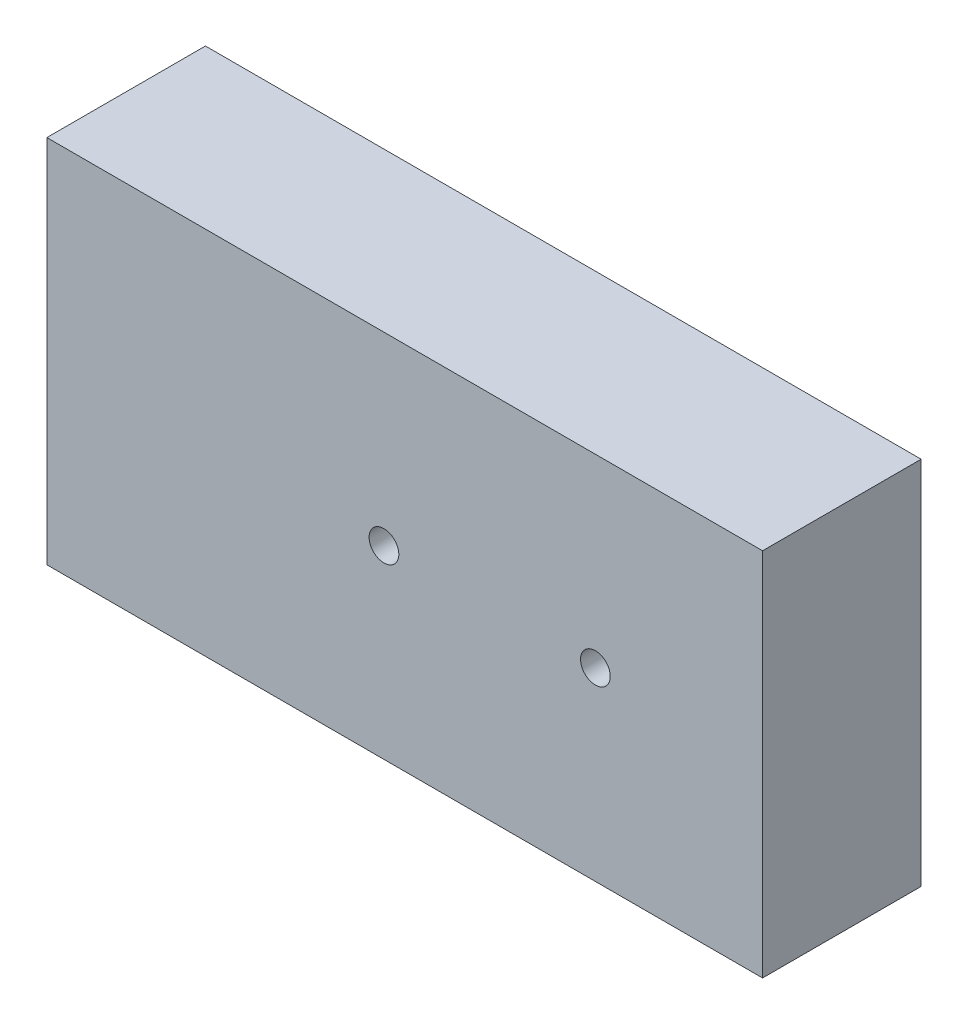
ISO-10303-21;
HEADER;
FILE_DESCRIPTION(('STEP AP214'),'2;1');
FILE_NAME('part.step','',(''),(''),'','','');
FILE_SCHEMA(('AUTOMOTIVE_DESIGN { 1 0 10303 214 1 1 1 1 }'));
ENDSEC;
DATA;
#1=APPLICATION_CONTEXT('core data for automotive mechanical design processes');
#2=APPLICATION_PROTOCOL_DEFINITION('international standard','automotive_design',2000,#1);
#3=PRODUCT_CONTEXT('',#1,'mechanical');
#4=PRODUCT('Part','Part','',(#3));
#5=PRODUCT_RELATED_PRODUCT_CATEGORY('part','',(#4));
#6=PRODUCT_DEFINITION_FORMATION('','',#4);
#7=PRODUCT_DEFINITION_CONTEXT('part definition',#1,'design');
#8=PRODUCT_DEFINITION('design','',#6,#7);
#9=PRODUCT_DEFINITION_SHAPE('','',#8);
#10=(LENGTH_UNIT() NAMED_UNIT(*) SI_UNIT(.MILLI.,.METRE.));
#11=(NAMED_UNIT(*) PLANE_ANGLE_UNIT() SI_UNIT($,.RADIAN.));
#12=(NAMED_UNIT(*) SI_UNIT($,.STERADIAN.) SOLID_ANGLE_UNIT());
#13=UNCERTAINTY_MEASURE_WITH_UNIT(LENGTH_MEASURE(1.E-05),#10,'distance_accuracy_value','');
#14=(GEOMETRIC_REPRESENTATION_CONTEXT(3) GLOBAL_UNCERTAINTY_ASSIGNED_CONTEXT((#13)) GLOBAL_UNIT_ASSIGNED_CONTEXT((#10,
#11,#12)) REPRESENTATION_CONTEXT('',''));
#15=CARTESIAN_POINT('',(0.,0.,0.));
#16=DIRECTION('',(0.,0.,1.));
#17=DIRECTION('',(1.,0.,0.));
#18=AXIS2_PLACEMENT_3D('',#15,#16,#17);
#19=CARTESIAN_POINT('',(171.958,0.,0.));
#20=DIRECTION('',(0.,0.,-1.));
#21=DIRECTION('',(-1.,0.,0.));
#22=AXIS2_PLACEMENT_3D('',#19,#20,#21);
#23=PLANE('',#22);
#24=CARTESIAN_POINT('',(131.79298,44.4500000000001,0.));
#25=DIRECTION('',(0.,0.,-1.));
#26=DIRECTION('',(-1.,0.,0.));
#27=AXIS2_PLACEMENT_3D('',#24,#25,#26);
#28=CIRCLE('',#27,3.57187500000001);
#29=CARTESIAN_POINT('',(128.221105,44.4500000000001,0.));
#30=VERTEX_POINT('',#29);
#31=EDGE_CURVE('E98',#30,#30,#28,.T.);
#32=ORIENTED_EDGE('',*,*,#31,.T.);
#33=EDGE_LOOP('',(#32));
#34=FACE_BOUND('',#33,.T.);
#35=CARTESIAN_POINT('',(80.99298,44.4500000000001,0.));
#36=DIRECTION('',(0.,0.,-1.));
#37=DIRECTION('',(-1.,0.,0.));
#38=AXIS2_PLACEMENT_3D('',#35,#36,#37);
#39=CIRCLE('',#38,3.57187500000001);
#40=CARTESIAN_POINT('',(77.421105,44.4500000000001,0.));
#41=VERTEX_POINT('',#40);
#42=EDGE_CURVE('E112',#41,#41,#39,.T.);
#43=ORIENTED_EDGE('',*,*,#42,.T.);
#44=EDGE_LOOP('',(#43));
#45=FACE_BOUND('',#44,.T.);
#46=DIRECTION('',(0.,-1.,0.));
#47=VECTOR('',#46,1.);
#48=CARTESIAN_POINT('',(0.,0.,0.));
#49=LINE('',#48,#47);
#50=CARTESIAN_POINT('',(0.,88.9,0.));
#51=VERTEX_POINT('',#50);
#52=CARTESIAN_POINT('',(0.,0.,0.));
#53=VERTEX_POINT('',#52);
#54=EDGE_CURVE('E95',#51,#53,#49,.T.);
#55=ORIENTED_EDGE('',*,*,#54,.T.);
#56=DIRECTION('',(-1.,0.,0.));
#57=VECTOR('',#56,1.);
#58=CARTESIAN_POINT('',(171.958,0.,0.));
#59=LINE('',#58,#57);
#60=CARTESIAN_POINT('',(171.958,0.,0.));
#61=VERTEX_POINT('',#60);
#62=EDGE_CURVE('E11',#61,#53,#59,.T.);
#63=ORIENTED_EDGE('',*,*,#62,.F.);
#64=DIRECTION('',(0.,-1.,0.));
#65=VECTOR('',#64,1.);
#66=CARTESIAN_POINT('',(171.958,0.,0.));
#67=LINE('',#66,#65);
#68=CARTESIAN_POINT('',(171.958,88.9,0.));
#69=VERTEX_POINT('',#68);
#70=EDGE_CURVE('E83',#69,#61,#67,.T.);
#71=ORIENTED_EDGE('',*,*,#70,.F.);
#72=DIRECTION('',(-1.,0.,0.));
#73=VECTOR('',#72,1.);
#74=CARTESIAN_POINT('',(171.958,88.9,0.));
#75=LINE('',#74,#73);
#76=EDGE_CURVE('E91',#69,#51,#75,.T.);
#77=ORIENTED_EDGE('',*,*,#76,.T.);
#78=EDGE_LOOP('',(#55,#63,#71,#77));
#79=FACE_BOUND('',#78,.T.);
#80=ADVANCED_FACE('F32',(#34,#45,#79),#23,.F.);
#81=CARTESIAN_POINT('',(171.958,0.,0.));
#82=DIRECTION('',(0.,1.,0.));
#83=DIRECTION('',(0.,0.,1.));
#84=AXIS2_PLACEMENT_3D('',#81,#82,#83);
#85=PLANE('',#84);
#86=DIRECTION('',(0.,0.,-1.));
#87=VECTOR('',#86,1.);
#88=CARTESIAN_POINT('',(0.,0.,0.));
#89=LINE('',#88,#87);
#90=CARTESIAN_POINT('',(0.,0.,-38.1));
#91=VERTEX_POINT('',#90);
#92=EDGE_CURVE('E87',#53,#91,#89,.T.);
#93=ORIENTED_EDGE('',*,*,#92,.T.);
#94=DIRECTION('',(-1.,0.,0.));
#95=VECTOR('',#94,1.);
#96=CARTESIAN_POINT('',(171.958,0.,-38.1));
#97=LINE('',#96,#95);
#98=CARTESIAN_POINT('',(171.958,0.,-38.1));
#99=VERTEX_POINT('',#98);
#100=EDGE_CURVE('E40',#99,#91,#97,.T.);
#101=ORIENTED_EDGE('',*,*,#100,.F.);
#102=DIRECTION('',(0.,0.,-1.));
#103=VECTOR('',#102,1.);
#104=CARTESIAN_POINT('',(171.958,0.,0.));
#105=LINE('',#104,#103);
#106=EDGE_CURVE('E78',#61,#99,#105,.T.);
#107=ORIENTED_EDGE('',*,*,#106,.F.);
#108=ORIENTED_EDGE('',*,*,#62,.T.);
#109=EDGE_LOOP('',(#93,#101,#107,#108));
#110=FACE_BOUND('',#109,.T.);
#111=ADVANCED_FACE('F86',(#110),#85,.F.);
#112=CARTESIAN_POINT('',(171.958,0.,-38.1));
#113=DIRECTION('',(0.,0.,1.));
#114=DIRECTION('',(1.,0.,0.));
#115=AXIS2_PLACEMENT_3D('',#112,#113,#114);
#116=PLANE('',#115);
#117=CARTESIAN_POINT('',(131.79298,44.4500000000001,-38.1));
#118=DIRECTION('',(0.,0.,-1.));
#119=DIRECTION('',(-1.,0.,0.));
#120=AXIS2_PLACEMENT_3D('',#117,#118,#119);
#121=CIRCLE('',#120,3.57187500000001);
#122=CARTESIAN_POINT('',(128.221105,44.4500000000001,-38.1));
#123=VERTEX_POINT('',#122);
#124=EDGE_CURVE('E115',#123,#123,#121,.T.);
#125=ORIENTED_EDGE('',*,*,#124,.F.);
#126=EDGE_LOOP('',(#125));
#127=FACE_BOUND('',#126,.T.);
#128=CARTESIAN_POINT('',(80.99298,44.4500000000001,-38.1));
#129=DIRECTION('',(0.,0.,-1.));
#130=DIRECTION('',(-1.,0.,0.));
#131=AXIS2_PLACEMENT_3D('',#128,#129,#130);
#132=CIRCLE('',#131,3.57187500000001);
#133=CARTESIAN_POINT('',(77.421105,44.4500000000001,-38.1));
#134=VERTEX_POINT('',#133);
#135=EDGE_CURVE('E109',#134,#134,#132,.T.);
#136=ORIENTED_EDGE('',*,*,#135,.F.);
#137=EDGE_LOOP('',(#136));
#138=FACE_BOUND('',#137,.T.);
#139=DIRECTION('',(0.,1.,0.));
#140=VECTOR('',#139,1.);
#141=CARTESIAN_POINT('',(0.,0.,-38.1));
#142=LINE('',#141,#140);
#143=CARTESIAN_POINT('',(0.,88.9,-38.1));
#144=VERTEX_POINT('',#143);
#145=EDGE_CURVE('E65',#91,#144,#142,.T.);
#146=ORIENTED_EDGE('',*,*,#145,.T.);
#147=DIRECTION('',(-1.,0.,0.));
#148=VECTOR('',#147,1.);
#149=CARTESIAN_POINT('',(171.958,88.9,-38.1));
#150=LINE('',#149,#148);
#151=CARTESIAN_POINT('',(171.958,88.9,-38.1));
#152=VERTEX_POINT('',#151);
#153=EDGE_CURVE('E88',#152,#144,#150,.T.);
#154=ORIENTED_EDGE('',*,*,#153,.F.);
#155=DIRECTION('',(0.,1.,0.));
#156=VECTOR('',#155,1.);
#157=CARTESIAN_POINT('',(171.958,0.,-38.1));
#158=LINE('',#157,#156);
#159=EDGE_CURVE('E81',#99,#152,#158,.T.);
#160=ORIENTED_EDGE('',*,*,#159,.F.);
#161=ORIENTED_EDGE('',*,*,#100,.T.);
#162=EDGE_LOOP('',(#146,#154,#160,#161));
#163=FACE_BOUND('',#162,.T.);
#164=ADVANCED_FACE('F89',(#127,#138,#163),#116,.F.);
#165=CARTESIAN_POINT('',(171.958,88.9,0.));
#166=DIRECTION('',(0.,-1.,0.));
#167=DIRECTION('',(0.,0.,-1.));
#168=AXIS2_PLACEMENT_3D('',#165,#166,#167);
#169=PLANE('',#168);
#170=DIRECTION('',(0.,0.,1.));
#171=VECTOR('',#170,1.);
#172=CARTESIAN_POINT('',(0.,88.9,0.));
#173=LINE('',#172,#171);
#174=EDGE_CURVE('E71',#144,#51,#173,.T.);
#175=ORIENTED_EDGE('',*,*,#174,.T.);
#176=ORIENTED_EDGE('',*,*,#76,.F.);
#177=DIRECTION('',(0.,0.,1.));
#178=VECTOR('',#177,1.);
#179=CARTESIAN_POINT('',(171.958,88.9,0.));
#180=LINE('',#179,#178);
#181=EDGE_CURVE('E48',#152,#69,#180,.T.);
#182=ORIENTED_EDGE('',*,*,#181,.F.);
#183=ORIENTED_EDGE('',*,*,#153,.T.);
#184=EDGE_LOOP('',(#175,#176,#182,#183));
#185=FACE_BOUND('',#184,.T.);
#186=ADVANCED_FACE('F103',(#185),#169,.F.);
#187=CARTESIAN_POINT('',(171.958,0.,0.));
#188=DIRECTION('',(-1.,0.,0.));
#189=DIRECTION('',(0.,0.,1.));
#190=AXIS2_PLACEMENT_3D('',#187,#188,#189);
#191=PLANE('',#190);
#192=ORIENTED_EDGE('',*,*,#70,.T.);
#193=ORIENTED_EDGE('',*,*,#106,.T.);
#194=ORIENTED_EDGE('',*,*,#159,.T.);
#195=ORIENTED_EDGE('',*,*,#181,.T.);
#196=EDGE_LOOP('',(#192,#193,#194,#195));
#197=FACE_BOUND('',#196,.T.);
#198=ADVANCED_FACE('F79',(#197),#191,.F.);
#199=CARTESIAN_POINT('',(0.,0.,0.));
#200=DIRECTION('',(-1.,0.,0.));
#201=DIRECTION('',(0.,0.,1.));
#202=AXIS2_PLACEMENT_3D('',#199,#200,#201);
#203=PLANE('',#202);
#204=ORIENTED_EDGE('',*,*,#54,.F.);
#205=ORIENTED_EDGE('',*,*,#174,.F.);
#206=ORIENTED_EDGE('',*,*,#145,.F.);
#207=ORIENTED_EDGE('',*,*,#92,.F.);
#208=EDGE_LOOP('',(#204,#205,#206,#207));
#209=FACE_BOUND('',#208,.T.);
#210=ADVANCED_FACE('F106',(#209),#203,.T.);
#211=CARTESIAN_POINT('',(80.99298,44.4500000000001,0.));
#212=DIRECTION('',(0.,0.,-1.));
#213=DIRECTION('',(-1.,0.,0.));
#214=AXIS2_PLACEMENT_3D('',#211,#212,#213);
#215=CYLINDRICAL_SURFACE('',#214,3.57187500000001);
#216=CARTESIAN_POINT('',(77.421105,44.4500000000001,0.));
#217=CARTESIAN_POINT('',(77.421105,44.4500000000001,-0.396875));
#218=CARTESIAN_POINT('',(77.421105,44.4500000000001,-0.79375));
#219=CARTESIAN_POINT('',(77.421105,44.4500000000001,-1.5875));
#220=CARTESIAN_POINT('',(77.421105,44.4500000000001,-1.984375));
#221=CARTESIAN_POINT('',(77.421105,44.4500000000001,-2.778125));
#222=CARTESIAN_POINT('',(77.421105,44.4500000000001,-3.175));
#223=CARTESIAN_POINT('',(77.421105,44.4500000000001,-3.96875));
#224=CARTESIAN_POINT('',(77.421105,44.4500000000001,-4.365625));
#225=CARTESIAN_POINT('',(77.421105,44.4500000000001,-5.159375));
#226=CARTESIAN_POINT('',(77.421105,44.4500000000001,-5.55625));
#227=CARTESIAN_POINT('',(77.421105,44.4500000000001,-6.35));
#228=CARTESIAN_POINT('',(77.421105,44.4500000000001,-6.746875));
#229=CARTESIAN_POINT('',(77.421105,44.4500000000001,-7.540625));
#230=CARTESIAN_POINT('',(77.421105,44.4500000000001,-7.9375));
#231=CARTESIAN_POINT('',(77.421105,44.4500000000001,-8.73125));
#232=CARTESIAN_POINT('',(77.421105,44.4500000000001,-9.128125));
#233=CARTESIAN_POINT('',(77.421105,44.4500000000001,-9.921875));
#234=CARTESIAN_POINT('',(77.421105,44.4500000000001,-10.31875));
#235=CARTESIAN_POINT('',(77.421105,44.4500000000001,-11.1125));
#236=CARTESIAN_POINT('',(77.421105,44.4500000000001,-11.509375));
#237=CARTESIAN_POINT('',(77.421105,44.4500000000001,-12.303125));
#238=CARTESIAN_POINT('',(77.421105,44.4500000000001,-12.7));
#239=CARTESIAN_POINT('',(77.421105,44.4500000000001,-13.49375));
#240=CARTESIAN_POINT('',(77.421105,44.4500000000001,-13.890625));
#241=CARTESIAN_POINT('',(77.421105,44.4500000000001,-14.684375));
#242=CARTESIAN_POINT('',(77.421105,44.4500000000001,-15.08125));
#243=CARTESIAN_POINT('',(77.421105,44.4500000000001,-15.875));
#244=CARTESIAN_POINT('',(77.421105,44.4500000000001,-16.271875));
#245=CARTESIAN_POINT('',(77.421105,44.4500000000001,-17.065625));
#246=CARTESIAN_POINT('',(77.421105,44.4500000000001,-17.4625));
#247=CARTESIAN_POINT('',(77.421105,44.4500000000001,-18.25625));
#248=CARTESIAN_POINT('',(77.421105,44.4500000000001,-18.653125));
#249=CARTESIAN_POINT('',(77.421105,44.4500000000001,-19.446875));
#250=CARTESIAN_POINT('',(77.421105,44.4500000000001,-19.84375));
#251=CARTESIAN_POINT('',(77.421105,44.4500000000001,-20.6375));
#252=CARTESIAN_POINT('',(77.421105,44.4500000000001,-21.034375));
#253=CARTESIAN_POINT('',(77.421105,44.4500000000001,-21.828125));
#254=CARTESIAN_POINT('',(77.421105,44.4500000000001,-22.225));
#255=CARTESIAN_POINT('',(77.421105,44.4500000000001,-23.01875));
#256=CARTESIAN_POINT('',(77.421105,44.4500000000001,-23.415625));
#257=CARTESIAN_POINT('',(77.421105,44.4500000000001,-24.209375));
#258=CARTESIAN_POINT('',(77.421105,44.4500000000001,-24.60625));
#259=CARTESIAN_POINT('',(77.421105,44.4500000000001,-25.4));
#260=CARTESIAN_POINT('',(77.421105,44.4500000000001,-25.796875));
#261=CARTESIAN_POINT('',(77.421105,44.4500000000001,-26.590625));
#262=CARTESIAN_POINT('',(77.421105,44.4500000000001,-26.9875));
#263=CARTESIAN_POINT('',(77.421105,44.4500000000001,-27.78125));
#264=CARTESIAN_POINT('',(77.421105,44.4500000000001,-28.178125));
#265=CARTESIAN_POINT('',(77.421105,44.4500000000001,-28.971875));
#266=CARTESIAN_POINT('',(77.421105,44.4500000000001,-29.36875));
#267=CARTESIAN_POINT('',(77.421105,44.4500000000001,-30.1625));
#268=CARTESIAN_POINT('',(77.421105,44.4500000000001,-30.559375));
#269=CARTESIAN_POINT('',(77.421105,44.4500000000001,-31.353125));
#270=CARTESIAN_POINT('',(77.421105,44.4500000000001,-31.75));
#271=CARTESIAN_POINT('',(77.421105,44.4500000000001,-32.54375));
#272=CARTESIAN_POINT('',(77.421105,44.4500000000001,-32.940625));
#273=CARTESIAN_POINT('',(77.421105,44.4500000000001,-33.734375));
#274=CARTESIAN_POINT('',(77.421105,44.4500000000001,-34.13125));
#275=CARTESIAN_POINT('',(77.421105,44.4500000000001,-34.925));
#276=CARTESIAN_POINT('',(77.421105,44.4500000000001,-35.321875));
#277=CARTESIAN_POINT('',(77.421105,44.4500000000001,-36.115625));
#278=CARTESIAN_POINT('',(77.421105,44.4500000000001,-36.5125));
#279=CARTESIAN_POINT('',(77.421105,44.4500000000001,-37.30625));
#280=CARTESIAN_POINT('',(77.421105,44.4500000000001,-37.703125));
#281=CARTESIAN_POINT('',(77.421105,44.4500000000001,-38.1));
#282=B_SPLINE_CURVE_WITH_KNOTS('',3,(#216,#217,#218,#219,#220,#221,#222,#223,#224,#225,#226,
#227,#228,#229,#230,#231,#232,#233,#234,#235,#236,#237,#238,#239,#240,#241,#242,#243,#244,#245,
#246,#247,#248,#249,#250,#251,#252,#253,#254,#255,#256,#257,#258,#259,#260,#261,#262,#263,#264,
#265,#266,#267,#268,#269,#270,#271,#272,#273,#274,#275,#276,#277,#278,#279,#280,#281),
.UNSPECIFIED.,.F.,.F.,(4,2,2,2,2,2,2,2,2,2,2,2,2,2,2,2,2,2,2,2,2,2,2,2,2,2,2,2,2,2,2,2,4),(0.,
1.190625,2.38125,3.571875,4.7625,5.953125,7.14375,8.334375,9.525,10.715625,11.90625,13.096875,
14.2875,15.478125,16.66875,17.859375,19.05,20.240625,21.43125,22.621875,23.8125,25.003125,
26.19375,27.384375,28.575,29.765625,30.95625,32.146875,33.3375,34.528125,35.71875,36.909375,
38.1),.UNSPECIFIED.);
#283=EDGE_CURVE('BSEAM126',#41,#134,#282,.T.);
#284=ORIENTED_EDGE('',*,*,#42,.F.);
#285=ORIENTED_EDGE('',*,*,#135,.T.);
#286=ORIENTED_EDGE('',*,*,#283,.T.);
#287=ORIENTED_EDGE('',*,*,#283,.F.);
#288=EDGE_LOOP('',(#284,#286,#285,#287));
#289=FACE_BOUND('',#288,.T.);
#290=ADVANCED_FACE('F126',(#289),#215,.F.);
#291=CARTESIAN_POINT('',(131.79298,44.4500000000001,0.));
#292=DIRECTION('',(0.,0.,-1.));
#293=DIRECTION('',(-1.,0.,0.));
#294=AXIS2_PLACEMENT_3D('',#291,#292,#293);
#295=CYLINDRICAL_SURFACE('',#294,3.57187500000001);
#296=CARTESIAN_POINT('',(128.221105,44.4500000000001,0.));
#297=CARTESIAN_POINT('',(128.221105,44.4500000000001,-0.396875));
#298=CARTESIAN_POINT('',(128.221105,44.4500000000001,-0.79375));
#299=CARTESIAN_POINT('',(128.221105,44.4500000000001,-1.5875));
#300=CARTESIAN_POINT('',(128.221105,44.4500000000001,-1.984375));
#301=CARTESIAN_POINT('',(128.221105,44.4500000000001,-2.778125));
#302=CARTESIAN_POINT('',(128.221105,44.4500000000001,-3.175));
#303=CARTESIAN_POINT('',(128.221105,44.4500000000001,-3.96875));
#304=CARTESIAN_POINT('',(128.221105,44.4500000000001,-4.365625));
#305=CARTESIAN_POINT('',(128.221105,44.4500000000001,-5.159375));
#306=CARTESIAN_POINT('',(128.221105,44.4500000000001,-5.55625));
#307=CARTESIAN_POINT('',(128.221105,44.4500000000001,-6.35));
#308=CARTESIAN_POINT('',(128.221105,44.4500000000001,-6.746875));
#309=CARTESIAN_POINT('',(128.221105,44.4500000000001,-7.540625));
#310=CARTESIAN_POINT('',(128.221105,44.4500000000001,-7.9375));
#311=CARTESIAN_POINT('',(128.221105,44.4500000000001,-8.73125));
#312=CARTESIAN_POINT('',(128.221105,44.4500000000001,-9.128125));
#313=CARTESIAN_POINT('',(128.221105,44.4500000000001,-9.921875));
#314=CARTESIAN_POINT('',(128.221105,44.4500000000001,-10.31875));
#315=CARTESIAN_POINT('',(128.221105,44.4500000000001,-11.1125));
#316=CARTESIAN_POINT('',(128.221105,44.4500000000001,-11.509375));
#317=CARTESIAN_POINT('',(128.221105,44.4500000000001,-12.303125));
#318=CARTESIAN_POINT('',(128.221105,44.4500000000001,-12.7));
#319=CARTESIAN_POINT('',(128.221105,44.4500000000001,-13.49375));
#320=CARTESIAN_POINT('',(128.221105,44.4500000000001,-13.890625));
#321=CARTESIAN_POINT('',(128.221105,44.4500000000001,-14.684375));
#322=CARTESIAN_POINT('',(128.221105,44.4500000000001,-15.08125));
#323=CARTESIAN_POINT('',(128.221105,44.4500000000001,-15.875));
#324=CARTESIAN_POINT('',(128.221105,44.4500000000001,-16.271875));
#325=CARTESIAN_POINT('',(128.221105,44.4500000000001,-17.065625));
#326=CARTESIAN_POINT('',(128.221105,44.4500000000001,-17.4625));
#327=CARTESIAN_POINT('',(128.221105,44.4500000000001,-18.25625));
#328=CARTESIAN_POINT('',(128.221105,44.4500000000001,-18.653125));
#329=CARTESIAN_POINT('',(128.221105,44.4500000000001,-19.446875));
#330=CARTESIAN_POINT('',(128.221105,44.4500000000001,-19.84375));
#331=CARTESIAN_POINT('',(128.221105,44.4500000000001,-20.6375));
#332=CARTESIAN_POINT('',(128.221105,44.4500000000001,-21.034375));
#333=CARTESIAN_POINT('',(128.221105,44.4500000000001,-21.828125));
#334=CARTESIAN_POINT('',(128.221105,44.4500000000001,-22.225));
#335=CARTESIAN_POINT('',(128.221105,44.4500000000001,-23.01875));
#336=CARTESIAN_POINT('',(128.221105,44.4500000000001,-23.415625));
#337=CARTESIAN_POINT('',(128.221105,44.4500000000001,-24.209375));
#338=CARTESIAN_POINT('',(128.221105,44.4500000000001,-24.60625));
#339=CARTESIAN_POINT('',(128.221105,44.4500000000001,-25.4));
#340=CARTESIAN_POINT('',(128.221105,44.4500000000001,-25.796875));
#341=CARTESIAN_POINT('',(128.221105,44.4500000000001,-26.590625));
#342=CARTESIAN_POINT('',(128.221105,44.4500000000001,-26.9875));
#343=CARTESIAN_POINT('',(128.221105,44.4500000000001,-27.78125));
#344=CARTESIAN_POINT('',(128.221105,44.4500000000001,-28.178125));
#345=CARTESIAN_POINT('',(128.221105,44.4500000000001,-28.971875));
#346=CARTESIAN_POINT('',(128.221105,44.4500000000001,-29.36875));
#347=CARTESIAN_POINT('',(128.221105,44.4500000000001,-30.1625));
#348=CARTESIAN_POINT('',(128.221105,44.4500000000001,-30.559375));
#349=CARTESIAN_POINT('',(128.221105,44.4500000000001,-31.353125));
#350=CARTESIAN_POINT('',(128.221105,44.4500000000001,-31.75));
#351=CARTESIAN_POINT('',(128.221105,44.4500000000001,-32.54375));
#352=CARTESIAN_POINT('',(128.221105,44.4500000000001,-32.940625));
#353=CARTESIAN_POINT('',(128.221105,44.4500000000001,-33.734375));
#354=CARTESIAN_POINT('',(128.221105,44.4500000000001,-34.13125));
#355=CARTESIAN_POINT('',(128.221105,44.4500000000001,-34.925));
#356=CARTESIAN_POINT('',(128.221105,44.4500000000001,-35.321875));
#357=CARTESIAN_POINT('',(128.221105,44.4500000000001,-36.115625));
#358=CARTESIAN_POINT('',(128.221105,44.4500000000001,-36.5125));
#359=CARTESIAN_POINT('',(128.221105,44.4500000000001,-37.30625));
#360=CARTESIAN_POINT('',(128.221105,44.4500000000001,-37.703125));
#361=CARTESIAN_POINT('',(128.221105,44.4500000000001,-38.1));
#362=B_SPLINE_CURVE_WITH_KNOTS('',3,(#296,#297,#298,#299,#300,#301,#302,#303,#304,#305,#306,
#307,#308,#309,#310,#311,#312,#313,#314,#315,#316,#317,#318,#319,#320,#321,#322,#323,#324,#325,
#326,#327,#328,#329,#330,#331,#332,#333,#334,#335,#336,#337,#338,#339,#340,#341,#342,#343,#344,
#345,#346,#347,#348,#349,#350,#351,#352,#353,#354,#355,#356,#357,#358,#359,#360,#361),
.UNSPECIFIED.,.F.,.F.,(4,2,2,2,2,2,2,2,2,2,2,2,2,2,2,2,2,2,2,2,2,2,2,2,2,2,2,2,2,2,2,2,4),(0.,
1.190625,2.38125,3.571875,4.7625,5.953125,7.14375,8.334375,9.525,10.715625,11.90625,13.096875,
14.2875,15.478125,16.66875,17.859375,19.05,20.240625,21.43125,22.621875,23.8125,25.003125,
26.19375,27.384375,28.575,29.765625,30.95625,32.146875,33.3375,34.528125,35.71875,36.909375,
38.1),.UNSPECIFIED.);
#363=EDGE_CURVE('BSEAM123',#30,#123,#362,.T.);
#364=ORIENTED_EDGE('',*,*,#31,.F.);
#365=ORIENTED_EDGE('',*,*,#124,.T.);
#366=ORIENTED_EDGE('',*,*,#363,.T.);
#367=ORIENTED_EDGE('',*,*,#363,.F.);
#368=EDGE_LOOP('',(#364,#366,#365,#367));
#369=FACE_BOUND('',#368,.T.);
#370=ADVANCED_FACE('F123',(#369),#295,.F.);
#371=CLOSED_SHELL('',(#80,#111,#164,#186,#198,#210,#290,#370));
#372=MANIFOLD_SOLID_BREP('B2',#371);
#373=ADVANCED_BREP_SHAPE_REPRESENTATION('',(#18,#372),#14);
#374=SHAPE_DEFINITION_REPRESENTATION(#9,#373);
ENDSEC;
END-ISO-10303-21;
